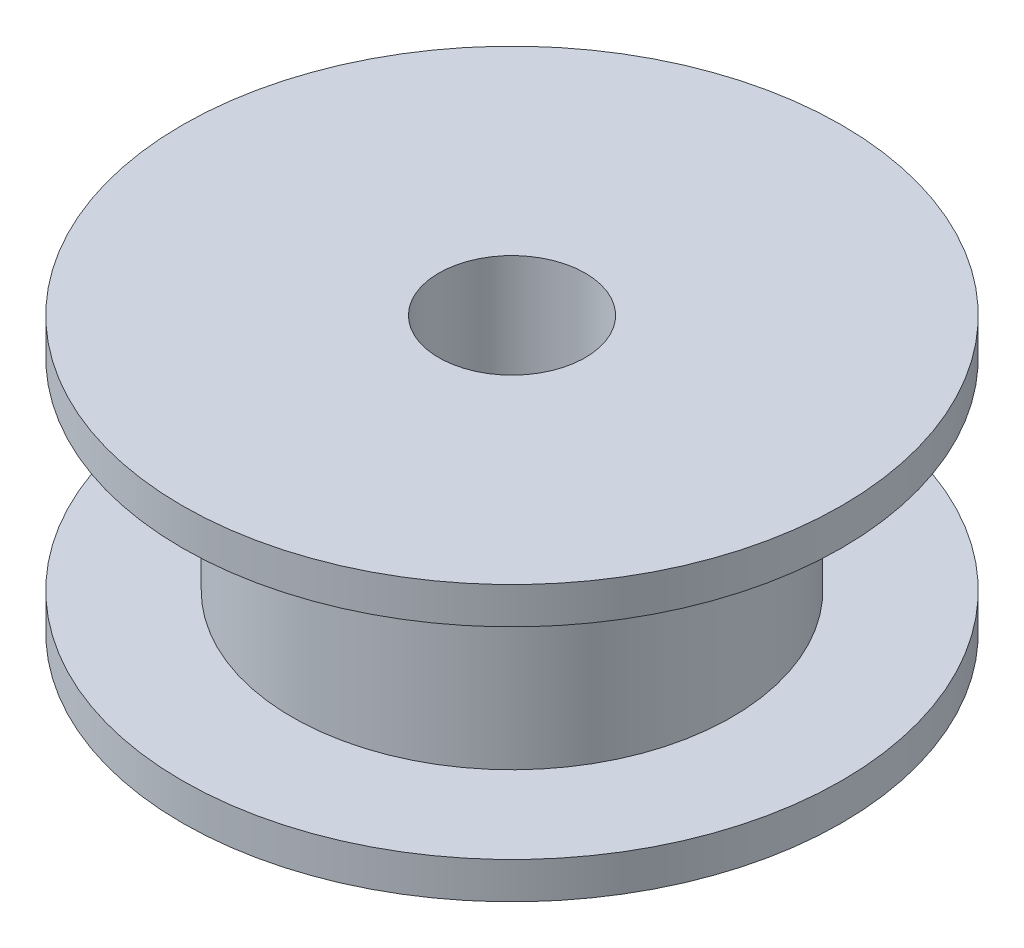
ISO-10303-21;
HEADER;
FILE_DESCRIPTION(('STEP AP214'),'2;1');
FILE_NAME('part.step','',(''),(''),'','','');
FILE_SCHEMA(('AUTOMOTIVE_DESIGN { 1 0 10303 214 1 1 1 1 }'));
ENDSEC;
DATA;
#1=APPLICATION_CONTEXT('core data for automotive mechanical design processes');
#2=APPLICATION_PROTOCOL_DEFINITION('international standard','automotive_design',2000,#1);
#3=PRODUCT_CONTEXT('',#1,'mechanical');
#4=PRODUCT('Part','Part','',(#3));
#5=PRODUCT_RELATED_PRODUCT_CATEGORY('part','',(#4));
#6=PRODUCT_DEFINITION_FORMATION('','',#4);
#7=PRODUCT_DEFINITION_CONTEXT('part definition',#1,'design');
#8=PRODUCT_DEFINITION('design','',#6,#7);
#9=PRODUCT_DEFINITION_SHAPE('','',#8);
#10=(LENGTH_UNIT() NAMED_UNIT(*) SI_UNIT(.MILLI.,.METRE.));
#11=(NAMED_UNIT(*) PLANE_ANGLE_UNIT() SI_UNIT($,.RADIAN.));
#12=(NAMED_UNIT(*) SI_UNIT($,.STERADIAN.) SOLID_ANGLE_UNIT());
#13=UNCERTAINTY_MEASURE_WITH_UNIT(LENGTH_MEASURE(1.E-05),#10,'distance_accuracy_value','');
#14=(GEOMETRIC_REPRESENTATION_CONTEXT(3) GLOBAL_UNCERTAINTY_ASSIGNED_CONTEXT((#13)) GLOBAL_UNIT_ASSIGNED_CONTEXT((#10,
#11,#12)) REPRESENTATION_CONTEXT('',''));
#15=CARTESIAN_POINT('',(0.,0.,0.));
#16=DIRECTION('',(0.,0.,1.));
#17=DIRECTION('',(1.,0.,0.));
#18=AXIS2_PLACEMENT_3D('',#15,#16,#17);
#19=CARTESIAN_POINT('',(0.,1.,0.));
#20=DIRECTION('',(0.,-1.,0.));
#21=DIRECTION('',(0.,0.,-1.));
#22=AXIS2_PLACEMENT_3D('',#19,#20,#21);
#23=CYLINDRICAL_SURFACE('',#22,9.);
#24=CARTESIAN_POINT('',(0.,1.,0.));
#25=DIRECTION('',(0.,1.,0.));
#26=DIRECTION('',(0.,0.,1.));
#27=AXIS2_PLACEMENT_3D('',#24,#25,#26);
#28=CIRCLE('',#27,9.);
#29=CARTESIAN_POINT('',(0.,1.,9.));
#30=VERTEX_POINT('',#29);
#31=EDGE_CURVE('E10',#30,#30,#28,.T.);
#32=ORIENTED_EDGE('',*,*,#31,.F.);
#33=EDGE_LOOP('',(#32));
#34=FACE_BOUND('',#33,.T.);
#35=CARTESIAN_POINT('',(0.,0.,0.));
#36=DIRECTION('',(0.,1.,0.));
#37=DIRECTION('',(0.,0.,1.));
#38=AXIS2_PLACEMENT_3D('',#35,#36,#37);
#39=CIRCLE('',#38,9.);
#40=CARTESIAN_POINT('',(0.,0.,9.));
#41=VERTEX_POINT('',#40);
#42=EDGE_CURVE('E33',#41,#41,#39,.T.);
#43=ORIENTED_EDGE('',*,*,#42,.T.);
#44=EDGE_LOOP('',(#43));
#45=FACE_BOUND('',#44,.T.);
#46=ADVANCED_FACE('F30',(#34,#45),#23,.T.);
#47=CARTESIAN_POINT('',(0.,1.,0.));
#48=DIRECTION('',(0.,1.,0.));
#49=DIRECTION('',(0.,0.,1.));
#50=AXIS2_PLACEMENT_3D('',#47,#48,#49);
#51=PLANE('',#50);
#52=CARTESIAN_POINT('',(0.,1.,0.));
#53=DIRECTION('',(0.,1.,0.));
#54=DIRECTION('',(0.,0.,1.));
#55=AXIS2_PLACEMENT_3D('',#52,#53,#54);
#56=CIRCLE('',#55,6.);
#57=CARTESIAN_POINT('',(0.,0.999999999999999,-6.));
#58=VERTEX_POINT('',#57);
#59=EDGE_CURVE('E37',#58,#58,#56,.T.);
#60=ORIENTED_EDGE('',*,*,#59,.F.);
#61=EDGE_LOOP('',(#60));
#62=FACE_BOUND('',#61,.T.);
#63=ORIENTED_EDGE('',*,*,#31,.T.);
#64=EDGE_LOOP('',(#63));
#65=FACE_BOUND('',#64,.T.);
#66=ADVANCED_FACE('F77',(#62,#65),#51,.T.);
#67=CARTESIAN_POINT('',(0.,0.,0.));
#68=DIRECTION('',(0.,1.,0.));
#69=DIRECTION('',(0.,0.,1.));
#70=AXIS2_PLACEMENT_3D('',#67,#68,#69);
#71=PLANE('',#70);
#72=ORIENTED_EDGE('',*,*,#42,.F.);
#73=EDGE_LOOP('',(#72));
#74=FACE_BOUND('',#73,.T.);
#75=CARTESIAN_POINT('',(0.,0.,0.));
#76=DIRECTION('',(0.,1.,0.));
#77=DIRECTION('',(0.,0.,1.));
#78=AXIS2_PLACEMENT_3D('',#75,#76,#77);
#79=CIRCLE('',#78,2.);
#80=CARTESIAN_POINT('',(0.,0.,-2.));
#81=VERTEX_POINT('',#80);
#82=EDGE_CURVE('E43',#81,#81,#79,.T.);
#83=ORIENTED_EDGE('',*,*,#82,.T.);
#84=EDGE_LOOP('',(#83));
#85=FACE_BOUND('',#84,.T.);
#86=ADVANCED_FACE('F82',(#74,#85),#71,.F.);
#87=CARTESIAN_POINT('',(0.,6.5,0.));
#88=DIRECTION('',(0.,-1.,0.));
#89=DIRECTION('',(0.,0.,-1.));
#90=AXIS2_PLACEMENT_3D('',#87,#88,#89);
#91=CYLINDRICAL_SURFACE('',#90,2.);
#92=CARTESIAN_POINT('',(0.,7.5,0.));
#93=DIRECTION('',(0.,1.,0.));
#94=DIRECTION('',(0.,0.,1.));
#95=AXIS2_PLACEMENT_3D('',#92,#93,#94);
#96=CIRCLE('',#95,2.);
#97=CARTESIAN_POINT('',(0.,7.5,-2.));
#98=VERTEX_POINT('',#97);
#99=EDGE_CURVE('E53',#98,#98,#96,.T.);
#100=CARTESIAN_POINT('',(0.,0.,-2.));
#101=CARTESIAN_POINT('',(0.,0.0781250000000002,-2.));
#102=CARTESIAN_POINT('',(0.,0.15625,-2.));
#103=CARTESIAN_POINT('',(0.,0.3125,-2.));
#104=CARTESIAN_POINT('',(0.,0.390625,-2.));
#105=CARTESIAN_POINT('',(0.,0.546875,-2.));
#106=CARTESIAN_POINT('',(0.,0.625,-2.));
#107=CARTESIAN_POINT('',(0.,0.78125,-2.));
#108=CARTESIAN_POINT('',(0.,0.859375,-2.));
#109=CARTESIAN_POINT('',(0.,1.015625,-2.));
#110=CARTESIAN_POINT('',(0.,1.09375,-2.));
#111=CARTESIAN_POINT('',(0.,1.25,-2.));
#112=CARTESIAN_POINT('',(0.,1.328125,-2.));
#113=CARTESIAN_POINT('',(0.,1.484375,-2.));
#114=CARTESIAN_POINT('',(0.,1.5625,-2.));
#115=CARTESIAN_POINT('',(0.,1.71875,-2.));
#116=CARTESIAN_POINT('',(0.,1.796875,-2.));
#117=CARTESIAN_POINT('',(0.,1.953125,-2.));
#118=CARTESIAN_POINT('',(0.,2.03125,-2.));
#119=CARTESIAN_POINT('',(0.,2.1875,-2.));
#120=CARTESIAN_POINT('',(0.,2.265625,-2.));
#121=CARTESIAN_POINT('',(0.,2.421875,-2.));
#122=CARTESIAN_POINT('',(0.,2.5,-2.));
#123=CARTESIAN_POINT('',(0.,2.65625,-2.));
#124=CARTESIAN_POINT('',(0.,2.734375,-2.));
#125=CARTESIAN_POINT('',(0.,2.890625,-2.));
#126=CARTESIAN_POINT('',(0.,2.96875,-2.));
#127=CARTESIAN_POINT('',(0.,3.125,-2.));
#128=CARTESIAN_POINT('',(0.,3.203125,-2.));
#129=CARTESIAN_POINT('',(0.,3.359375,-2.));
#130=CARTESIAN_POINT('',(0.,3.4375,-2.));
#131=CARTESIAN_POINT('',(0.,3.59375,-2.));
#132=CARTESIAN_POINT('',(0.,3.671875,-2.));
#133=CARTESIAN_POINT('',(0.,3.828125,-2.));
#134=CARTESIAN_POINT('',(0.,3.90625,-2.));
#135=CARTESIAN_POINT('',(0.,4.0625,-2.));
#136=CARTESIAN_POINT('',(0.,4.140625,-2.));
#137=CARTESIAN_POINT('',(0.,4.296875,-2.));
#138=CARTESIAN_POINT('',(0.,4.375,-2.));
#139=CARTESIAN_POINT('',(0.,4.53125,-2.));
#140=CARTESIAN_POINT('',(0.,4.609375,-2.));
#141=CARTESIAN_POINT('',(0.,4.765625,-2.));
#142=CARTESIAN_POINT('',(0.,4.84375,-2.));
#143=CARTESIAN_POINT('',(0.,5.,-2.));
#144=CARTESIAN_POINT('',(0.,5.078125,-2.));
#145=CARTESIAN_POINT('',(0.,5.234375,-2.));
#146=CARTESIAN_POINT('',(0.,5.3125,-2.));
#147=CARTESIAN_POINT('',(0.,5.46875,-2.));
#148=CARTESIAN_POINT('',(0.,5.546875,-2.));
#149=CARTESIAN_POINT('',(0.,5.703125,-2.));
#150=CARTESIAN_POINT('',(0.,5.78125,-2.));
#151=CARTESIAN_POINT('',(0.,5.9375,-2.));
#152=CARTESIAN_POINT('',(0.,6.015625,-2.));
#153=CARTESIAN_POINT('',(0.,6.171875,-2.));
#154=CARTESIAN_POINT('',(0.,6.25,-2.));
#155=CARTESIAN_POINT('',(0.,6.40625,-2.));
#156=CARTESIAN_POINT('',(0.,6.484375,-2.));
#157=CARTESIAN_POINT('',(0.,6.640625,-2.));
#158=CARTESIAN_POINT('',(0.,6.71875,-2.));
#159=CARTESIAN_POINT('',(0.,6.875,-2.));
#160=CARTESIAN_POINT('',(0.,6.953125,-2.));
#161=CARTESIAN_POINT('',(0.,7.109375,-2.));
#162=CARTESIAN_POINT('',(0.,7.1875,-2.));
#163=CARTESIAN_POINT('',(0.,7.34375,-2.));
#164=CARTESIAN_POINT('',(0.,7.421875,-2.));
#165=CARTESIAN_POINT('',(0.,7.5,-2.));
#166=B_SPLINE_CURVE_WITH_KNOTS('',3,(#100,#101,#102,#103,#104,#105,#106,#107,#108,#109,#110,
#111,#112,#113,#114,#115,#116,#117,#118,#119,#120,#121,#122,#123,#124,#125,#126,#127,#128,#129,
#130,#131,#132,#133,#134,#135,#136,#137,#138,#139,#140,#141,#142,#143,#144,#145,#146,#147,#148,
#149,#150,#151,#152,#153,#154,#155,#156,#157,#158,#159,#160,#161,#162,#163,#164,#165),
.UNSPECIFIED.,.F.,.F.,(4,2,2,2,2,2,2,2,2,2,2,2,2,2,2,2,2,2,2,2,2,2,2,2,2,2,2,2,2,2,2,2,4),(0.,
0.234375,0.46875,0.703125,0.9375,1.171875,1.40625,1.640625,1.875,2.109375,2.34375,2.578125,
2.8125,3.046875,3.28125,3.515625,3.75,3.984375,4.21875,4.453125,4.6875,4.921875,5.15625,
5.390625,5.625,5.859375,6.09375,6.328125,6.5625,6.796875,7.03125,7.265625,7.5),.UNSPECIFIED.);
#167=EDGE_CURVE('BSEAM59',#81,#98,#166,.T.);
#168=ORIENTED_EDGE('',*,*,#82,.F.);
#169=ORIENTED_EDGE('',*,*,#99,.T.);
#170=ORIENTED_EDGE('',*,*,#167,.T.);
#171=ORIENTED_EDGE('',*,*,#167,.F.);
#172=EDGE_LOOP('',(#168,#170,#169,#171));
#173=FACE_BOUND('',#172,.T.);
#174=ADVANCED_FACE('F59',(#173),#91,.F.);
#175=CARTESIAN_POINT('',(0.,6.5,0.));
#176=DIRECTION('',(0.,-1.,0.));
#177=DIRECTION('',(0.,0.,-1.));
#178=AXIS2_PLACEMENT_3D('',#175,#176,#177);
#179=CYLINDRICAL_SURFACE('',#178,6.);
#180=CARTESIAN_POINT('',(0.,6.5,0.));
#181=DIRECTION('',(0.,1.,0.));
#182=DIRECTION('',(0.,0.,1.));
#183=AXIS2_PLACEMENT_3D('',#180,#181,#182);
#184=CIRCLE('',#183,6.);
#185=CARTESIAN_POINT('',(0.,6.5,-6.));
#186=VERTEX_POINT('',#185);
#187=EDGE_CURVE('E46',#186,#186,#184,.T.);
#188=CARTESIAN_POINT('',(0.,0.999999999999999,-6.));
#189=CARTESIAN_POINT('',(0.,1.05729166666667,-6.));
#190=CARTESIAN_POINT('',(0.,1.11458333333333,-6.));
#191=CARTESIAN_POINT('',(0.,1.22916666666667,-6.));
#192=CARTESIAN_POINT('',(0.,1.28645833333333,-6.));
#193=CARTESIAN_POINT('',(0.,1.40104166666667,-6.));
#194=CARTESIAN_POINT('',(0.,1.45833333333333,-6.));
#195=CARTESIAN_POINT('',(0.,1.57291666666667,-6.));
#196=CARTESIAN_POINT('',(0.,1.63020833333333,-6.));
#197=CARTESIAN_POINT('',(0.,1.74479166666667,-6.));
#198=CARTESIAN_POINT('',(0.,1.80208333333333,-6.));
#199=CARTESIAN_POINT('',(0.,1.91666666666667,-6.));
#200=CARTESIAN_POINT('',(0.,1.97395833333333,-6.));
#201=CARTESIAN_POINT('',(0.,2.08854166666667,-6.));
#202=CARTESIAN_POINT('',(0.,2.14583333333333,-6.));
#203=CARTESIAN_POINT('',(0.,2.26041666666667,-6.));
#204=CARTESIAN_POINT('',(0.,2.31770833333333,-6.));
#205=CARTESIAN_POINT('',(0.,2.43229166666667,-6.));
#206=CARTESIAN_POINT('',(0.,2.48958333333333,-6.));
#207=CARTESIAN_POINT('',(0.,2.60416666666667,-6.));
#208=CARTESIAN_POINT('',(0.,2.66145833333333,-6.));
#209=CARTESIAN_POINT('',(0.,2.77604166666667,-6.));
#210=CARTESIAN_POINT('',(0.,2.83333333333333,-6.));
#211=CARTESIAN_POINT('',(0.,2.94791666666667,-6.));
#212=CARTESIAN_POINT('',(0.,3.00520833333333,-6.));
#213=CARTESIAN_POINT('',(0.,3.11979166666667,-6.));
#214=CARTESIAN_POINT('',(0.,3.17708333333333,-6.));
#215=CARTESIAN_POINT('',(0.,3.29166666666667,-6.));
#216=CARTESIAN_POINT('',(0.,3.34895833333333,-6.));
#217=CARTESIAN_POINT('',(0.,3.46354166666667,-6.));
#218=CARTESIAN_POINT('',(0.,3.52083333333333,-6.));
#219=CARTESIAN_POINT('',(0.,3.63541666666667,-6.));
#220=CARTESIAN_POINT('',(0.,3.69270833333333,-6.));
#221=CARTESIAN_POINT('',(0.,3.80729166666667,-6.));
#222=CARTESIAN_POINT('',(0.,3.86458333333333,-6.));
#223=CARTESIAN_POINT('',(0.,3.97916666666667,-6.));
#224=CARTESIAN_POINT('',(0.,4.03645833333333,-6.));
#225=CARTESIAN_POINT('',(0.,4.15104166666667,-6.));
#226=CARTESIAN_POINT('',(0.,4.20833333333333,-6.));
#227=CARTESIAN_POINT('',(0.,4.32291666666667,-6.));
#228=CARTESIAN_POINT('',(0.,4.38020833333333,-6.));
#229=CARTESIAN_POINT('',(0.,4.49479166666667,-6.));
#230=CARTESIAN_POINT('',(0.,4.55208333333333,-6.));
#231=CARTESIAN_POINT('',(0.,4.66666666666667,-6.));
#232=CARTESIAN_POINT('',(0.,4.72395833333333,-6.));
#233=CARTESIAN_POINT('',(0.,4.83854166666667,-6.));
#234=CARTESIAN_POINT('',(0.,4.89583333333333,-6.));
#235=CARTESIAN_POINT('',(0.,5.01041666666667,-6.));
#236=CARTESIAN_POINT('',(0.,5.06770833333333,-6.));
#237=CARTESIAN_POINT('',(0.,5.18229166666667,-6.));
#238=CARTESIAN_POINT('',(0.,5.23958333333333,-6.));
#239=CARTESIAN_POINT('',(0.,5.35416666666667,-6.));
#240=CARTESIAN_POINT('',(0.,5.41145833333333,-6.));
#241=CARTESIAN_POINT('',(0.,5.52604166666667,-6.));
#242=CARTESIAN_POINT('',(0.,5.58333333333333,-6.));
#243=CARTESIAN_POINT('',(0.,5.69791666666667,-6.));
#244=CARTESIAN_POINT('',(0.,5.75520833333333,-6.));
#245=CARTESIAN_POINT('',(0.,5.86979166666667,-6.));
#246=CARTESIAN_POINT('',(0.,5.92708333333333,-6.));
#247=CARTESIAN_POINT('',(0.,6.04166666666667,-6.));
#248=CARTESIAN_POINT('',(0.,6.09895833333333,-6.));
#249=CARTESIAN_POINT('',(0.,6.21354166666667,-6.));
#250=CARTESIAN_POINT('',(0.,6.27083333333333,-6.));
#251=CARTESIAN_POINT('',(0.,6.38541666666667,-6.));
#252=CARTESIAN_POINT('',(0.,6.44270833333333,-6.));
#253=CARTESIAN_POINT('',(0.,6.5,-6.));
#254=B_SPLINE_CURVE_WITH_KNOTS('',3,(#188,#189,#190,#191,#192,#193,#194,#195,#196,#197,#198,
#199,#200,#201,#202,#203,#204,#205,#206,#207,#208,#209,#210,#211,#212,#213,#214,#215,#216,#217,
#218,#219,#220,#221,#222,#223,#224,#225,#226,#227,#228,#229,#230,#231,#232,#233,#234,#235,#236,
#237,#238,#239,#240,#241,#242,#243,#244,#245,#246,#247,#248,#249,#250,#251,#252,#253),
.UNSPECIFIED.,.F.,.F.,(4,2,2,2,2,2,2,2,2,2,2,2,2,2,2,2,2,2,2,2,2,2,2,2,2,2,2,2,2,2,2,2,4),(0.,
0.171875,0.34375,0.515625,0.687500000000001,0.859375,1.03125,1.203125,1.375,1.546875,1.71875,
1.890625,2.0625,2.234375,2.40625,2.578125,2.75,2.921875,3.09375,3.265625,3.4375,3.609375,
3.78125,3.953125,4.125,4.296875,4.46875,4.640625,4.8125,4.984375,5.15625,5.328125,5.5),.UNSPECIFIED.);
#255=EDGE_CURVE('BSEAM64',#58,#186,#254,.T.);
#256=ORIENTED_EDGE('',*,*,#59,.T.);
#257=ORIENTED_EDGE('',*,*,#187,.F.);
#258=ORIENTED_EDGE('',*,*,#255,.T.);
#259=ORIENTED_EDGE('',*,*,#255,.F.);
#260=EDGE_LOOP('',(#256,#258,#257,#259));
#261=FACE_BOUND('',#260,.T.);
#262=ADVANCED_FACE('F64',(#261),#179,.T.);
#263=CARTESIAN_POINT('',(0.,7.5,0.));
#264=DIRECTION('',(0.,1.,0.));
#265=DIRECTION('',(0.,0.,1.));
#266=AXIS2_PLACEMENT_3D('',#263,#264,#265);
#267=PLANE('',#266);
#268=CARTESIAN_POINT('',(0.,7.5,0.));
#269=DIRECTION('',(0.,1.,0.));
#270=DIRECTION('',(0.,0.,1.));
#271=AXIS2_PLACEMENT_3D('',#268,#269,#270);
#272=CIRCLE('',#271,9.);
#273=CARTESIAN_POINT('',(0.,7.5,9.));
#274=VERTEX_POINT('',#273);
#275=EDGE_CURVE('E47',#274,#274,#272,.T.);
#276=ORIENTED_EDGE('',*,*,#275,.T.);
#277=EDGE_LOOP('',(#276));
#278=FACE_BOUND('',#277,.T.);
#279=ORIENTED_EDGE('',*,*,#99,.F.);
#280=EDGE_LOOP('',(#279));
#281=FACE_BOUND('',#280,.T.);
#282=ADVANCED_FACE('F61',(#278,#281),#267,.T.);
#283=CARTESIAN_POINT('',(0.,6.5,0.));
#284=DIRECTION('',(0.,1.,0.));
#285=DIRECTION('',(0.,0.,1.));
#286=AXIS2_PLACEMENT_3D('',#283,#284,#285);
#287=PLANE('',#286);
#288=ORIENTED_EDGE('',*,*,#187,.T.);
#289=EDGE_LOOP('',(#288));
#290=FACE_BOUND('',#289,.T.);
#291=CARTESIAN_POINT('',(0.,6.5,0.));
#292=DIRECTION('',(0.,1.,0.));
#293=DIRECTION('',(0.,0.,1.));
#294=AXIS2_PLACEMENT_3D('',#291,#292,#293);
#295=CIRCLE('',#294,9.);
#296=CARTESIAN_POINT('',(0.,6.5,9.));
#297=VERTEX_POINT('',#296);
#298=EDGE_CURVE('E50',#297,#297,#295,.T.);
#299=ORIENTED_EDGE('',*,*,#298,.F.);
#300=EDGE_LOOP('',(#299));
#301=FACE_BOUND('',#300,.T.);
#302=ADVANCED_FACE('F63',(#290,#301),#287,.F.);
#303=CARTESIAN_POINT('',(0.,7.5,0.));
#304=DIRECTION('',(0.,-1.,0.));
#305=DIRECTION('',(0.,0.,-1.));
#306=AXIS2_PLACEMENT_3D('',#303,#304,#305);
#307=CYLINDRICAL_SURFACE('',#306,9.);
#308=ORIENTED_EDGE('',*,*,#275,.F.);
#309=EDGE_LOOP('',(#308));
#310=FACE_BOUND('',#309,.T.);
#311=ORIENTED_EDGE('',*,*,#298,.T.);
#312=EDGE_LOOP('',(#311));
#313=FACE_BOUND('',#312,.T.);
#314=ADVANCED_FACE('F71',(#310,#313),#307,.T.);
#315=CLOSED_SHELL('',(#46,#66,#86,#174,#262,#282,#302,#314));
#316=MANIFOLD_SOLID_BREP('B2',#315);
#317=ADVANCED_BREP_SHAPE_REPRESENTATION('',(#18,#316),#14);
#318=SHAPE_DEFINITION_REPRESENTATION(#9,#317);
ENDSEC;
END-ISO-10303-21;
